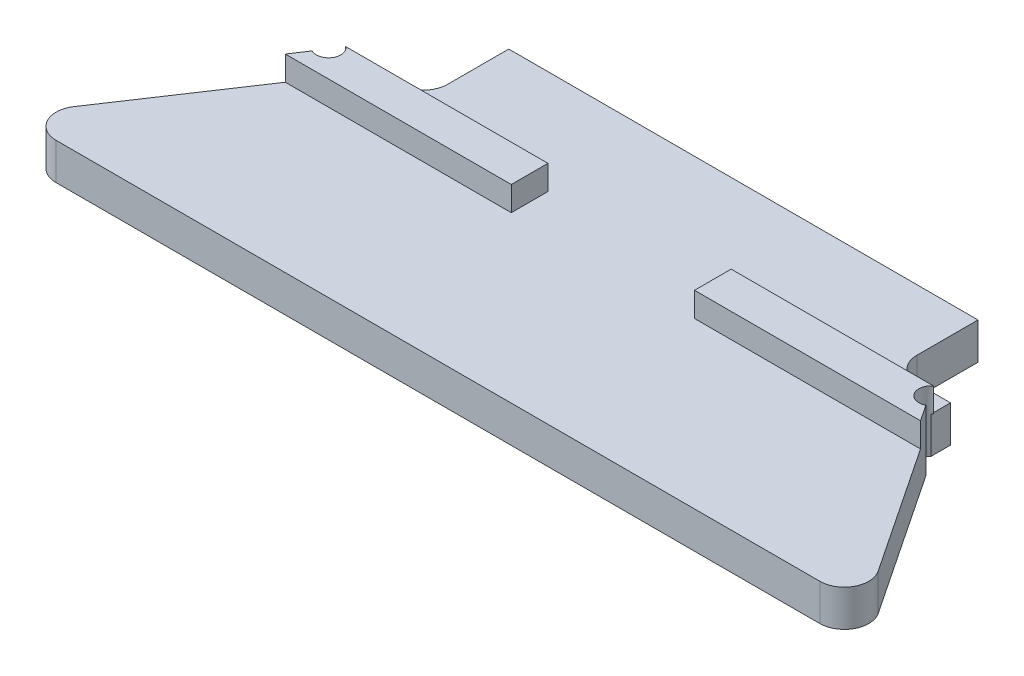
ISO-10303-21;
HEADER;
FILE_DESCRIPTION(('STEP AP214'),'2;1');
FILE_NAME('part.step','',(''),(''),'','','');
FILE_SCHEMA(('AUTOMOTIVE_DESIGN { 1 0 10303 214 1 1 1 1 }'));
ENDSEC;
DATA;
#1=APPLICATION_CONTEXT('core data for automotive mechanical design processes');
#2=APPLICATION_PROTOCOL_DEFINITION('international standard','automotive_design',2000,#1);
#3=PRODUCT_CONTEXT('',#1,'mechanical');
#4=PRODUCT('Part','Part','',(#3));
#5=PRODUCT_RELATED_PRODUCT_CATEGORY('part','',(#4));
#6=PRODUCT_DEFINITION_FORMATION('','',#4);
#7=PRODUCT_DEFINITION_CONTEXT('part definition',#1,'design');
#8=PRODUCT_DEFINITION('design','',#6,#7);
#9=PRODUCT_DEFINITION_SHAPE('','',#8);
#10=(LENGTH_UNIT() NAMED_UNIT(*) SI_UNIT(.MILLI.,.METRE.));
#11=(NAMED_UNIT(*) PLANE_ANGLE_UNIT() SI_UNIT($,.RADIAN.));
#12=(NAMED_UNIT(*) SI_UNIT($,.STERADIAN.) SOLID_ANGLE_UNIT());
#13=UNCERTAINTY_MEASURE_WITH_UNIT(LENGTH_MEASURE(1.E-05),#10,'distance_accuracy_value','');
#14=(GEOMETRIC_REPRESENTATION_CONTEXT(3) GLOBAL_UNCERTAINTY_ASSIGNED_CONTEXT((#13)) GLOBAL_UNIT_ASSIGNED_CONTEXT((#10,
#11,#12)) REPRESENTATION_CONTEXT('',''));
#15=CARTESIAN_POINT('',(0.,0.,0.));
#16=DIRECTION('',(0.,0.,1.));
#17=DIRECTION('',(1.,0.,0.));
#18=AXIS2_PLACEMENT_3D('',#15,#16,#17);
#19=CARTESIAN_POINT('',(0.,1.5,0.));
#20=DIRECTION('',(0.,1.,0.));
#21=DIRECTION('',(0.,0.,1.));
#22=AXIS2_PLACEMENT_3D('',#19,#20,#21);
#23=PLANE('',#22);
#24=DIRECTION('',(0.,0.,1.));
#25=VECTOR('',#24,1.);
#26=CARTESIAN_POINT('',(7.50000000000001,1.5,-4.00000000000001));
#27=LINE('',#26,#25);
#28=CARTESIAN_POINT('',(7.50000000000001,1.5,-4.00000000000001));
#29=VERTEX_POINT('',#28);
#30=CARTESIAN_POINT('',(7.50000000000001,1.5,-1.00000000000001));
#31=VERTEX_POINT('',#30);
#32=EDGE_CURVE('E545',#29,#31,#27,.T.);
#33=ORIENTED_EDGE('',*,*,#32,.F.);
#34=DIRECTION('',(-1.,0.,0.));
#35=VECTOR('',#34,1.);
#36=CARTESIAN_POINT('',(24.0539961789487,1.5,-4.00000000000001));
#37=LINE('',#36,#35);
#38=CARTESIAN_POINT('',(23.95625,1.5,-4.00000000000001));
#39=VERTEX_POINT('',#38);
#40=EDGE_CURVE('E523',#39,#29,#37,.T.);
#41=ORIENTED_EDGE('',*,*,#40,.F.);
#42=DIRECTION('',(0.,0.,1.));
#43=VECTOR('',#42,1.);
#44=CARTESIAN_POINT('',(23.95625,1.5,0.));
#45=LINE('',#44,#43);
#46=CARTESIAN_POINT('',(23.95625,1.5,-5.50000000000001));
#47=VERTEX_POINT('',#46);
#48=EDGE_CURVE('E286',#47,#39,#45,.T.);
#49=ORIENTED_EDGE('',*,*,#48,.F.);
#50=DIRECTION('',(-1.,0.,0.));
#51=VECTOR('',#50,1.);
#52=CARTESIAN_POINT('',(24.20625,1.5,-5.50000000000001));
#53=LINE('',#52,#51);
#54=CARTESIAN_POINT('',(21.20625,1.5,-5.50000000000001));
#55=VERTEX_POINT('',#54);
#56=EDGE_CURVE('E304',#47,#55,#53,.T.);
#57=ORIENTED_EDGE('',*,*,#56,.T.);
#58=CARTESIAN_POINT('',(21.20625,1.5,-7.50000000000001));
#59=DIRECTION('',(0.,1.,0.));
#60=DIRECTION('',(0.,0.,1.));
#61=AXIS2_PLACEMENT_3D('',#58,#59,#60);
#62=CIRCLE('',#61,2.);
#63=CARTESIAN_POINT('',(19.20625,1.5,-7.50000000000001));
#64=VERTEX_POINT('',#63);
#65=EDGE_CURVE('E379',#55,#64,#62,.F.);
#66=ORIENTED_EDGE('',*,*,#65,.T.);
#67=DIRECTION('',(0.,0.,-1.));
#68=VECTOR('',#67,1.);
#69=CARTESIAN_POINT('',(19.20625,1.5,-5.50000000000001));
#70=LINE('',#69,#68);
#71=CARTESIAN_POINT('',(19.20625,1.5,-12.5));
#72=VERTEX_POINT('',#71);
#73=EDGE_CURVE('E307',#64,#72,#70,.T.);
#74=ORIENTED_EDGE('',*,*,#73,.T.);
#75=DIRECTION('',(-1.,0.,0.));
#76=VECTOR('',#75,1.);
#77=CARTESIAN_POINT('',(-19.20625,1.5,-12.5));
#78=LINE('',#77,#76);
#79=CARTESIAN_POINT('',(-19.20625,1.5,-12.5));
#80=VERTEX_POINT('',#79);
#81=EDGE_CURVE('E309',#72,#80,#78,.T.);
#82=ORIENTED_EDGE('',*,*,#81,.T.);
#83=DIRECTION('',(0.,0.,1.));
#84=VECTOR('',#83,1.);
#85=CARTESIAN_POINT('',(-19.20625,1.5,-5.50000000000001));
#86=LINE('',#85,#84);
#87=CARTESIAN_POINT('',(-19.20625,1.5,-7.50000000000001));
#88=VERTEX_POINT('',#87);
#89=EDGE_CURVE('E311',#80,#88,#86,.T.);
#90=ORIENTED_EDGE('',*,*,#89,.T.);
#91=CARTESIAN_POINT('',(-21.20625,1.5,-7.50000000000001));
#92=DIRECTION('',(0.,1.,0.));
#93=DIRECTION('',(0.,0.,1.));
#94=AXIS2_PLACEMENT_3D('',#91,#92,#93);
#95=CIRCLE('',#94,2.);
#96=CARTESIAN_POINT('',(-21.20625,1.5,-5.50000000000001));
#97=VERTEX_POINT('',#96);
#98=EDGE_CURVE('E11',#88,#97,#95,.F.);
#99=ORIENTED_EDGE('',*,*,#98,.T.);
#100=DIRECTION('',(-1.,0.,0.));
#101=VECTOR('',#100,1.);
#102=CARTESIAN_POINT('',(-24.20625,1.5,-5.50000000000001));
#103=LINE('',#102,#101);
#104=CARTESIAN_POINT('',(-23.95625,1.5,-5.50000000000001));
#105=VERTEX_POINT('',#104);
#106=EDGE_CURVE('E314',#97,#105,#103,.T.);
#107=ORIENTED_EDGE('',*,*,#106,.T.);
#108=DIRECTION('',(0.,0.,-1.));
#109=VECTOR('',#108,1.);
#110=CARTESIAN_POINT('',(-23.95625,1.5,0.));
#111=LINE('',#110,#109);
#112=CARTESIAN_POINT('',(-23.95625,1.5,-4.00000000000001));
#113=VERTEX_POINT('',#112);
#114=EDGE_CURVE('E292',#113,#105,#111,.T.);
#115=ORIENTED_EDGE('',*,*,#114,.F.);
#116=DIRECTION('',(-1.,0.,0.));
#117=VECTOR('',#116,1.);
#118=CARTESIAN_POINT('',(-24.0539961789487,1.5,-4.00000000000001));
#119=LINE('',#118,#117);
#120=CARTESIAN_POINT('',(-7.49999999999999,1.5,-4.00000000000001));
#121=VERTEX_POINT('',#120);
#122=EDGE_CURVE('E53',#121,#113,#119,.T.);
#123=ORIENTED_EDGE('',*,*,#122,.F.);
#124=DIRECTION('',(0.,0.,-1.));
#125=VECTOR('',#124,1.);
#126=CARTESIAN_POINT('',(-7.49999999999999,1.5,-4.00000000000001));
#127=LINE('',#126,#125);
#128=CARTESIAN_POINT('',(-7.49999999999999,1.5,-1.00000000000001));
#129=VERTEX_POINT('',#128);
#130=EDGE_CURVE('E252',#129,#121,#127,.T.);
#131=ORIENTED_EDGE('',*,*,#130,.F.);
#132=DIRECTION('',(1.,0.,0.));
#133=VECTOR('',#132,1.);
#134=CARTESIAN_POINT('',(-7.49999999999999,1.5,-1.00000000000001));
#135=LINE('',#134,#133);
#136=CARTESIAN_POINT('',(-26.,1.5,-1.00000000000001));
#137=VERTEX_POINT('',#136);
#138=EDGE_CURVE('E59',#137,#129,#135,.T.);
#139=ORIENTED_EDGE('',*,*,#138,.F.);
#140=DIRECTION('',(-0.554700196225229,0.,0.832050294337844));
#141=VECTOR('',#140,1.);
#142=CARTESIAN_POINT('',(-25.,1.5,-2.49999999999999));
#143=LINE('',#142,#141);
#144=CARTESIAN_POINT('',(-32.927066405033,1.5,9.39059960754954));
#145=VERTEX_POINT('',#144);
#146=EDGE_CURVE('E317',#137,#145,#143,.T.);
#147=ORIENTED_EDGE('',*,*,#146,.T.);
#148=CARTESIAN_POINT('',(-31.2629658163573,1.5,10.5));
#149=DIRECTION('',(0.,1.,0.));
#150=DIRECTION('',(0.,0.,1.));
#151=AXIS2_PLACEMENT_3D('',#148,#149,#150);
#152=CIRCLE('',#151,2.);
#153=CARTESIAN_POINT('',(-31.2629658163573,1.5,12.5));
#154=VERTEX_POINT('',#153);
#155=EDGE_CURVE('E365',#145,#154,#152,.T.);
#156=ORIENTED_EDGE('',*,*,#155,.T.);
#157=DIRECTION('',(1.,0.,0.));
#158=VECTOR('',#157,1.);
#159=CARTESIAN_POINT('',(-35.,1.5,12.5));
#160=LINE('',#159,#158);
#161=CARTESIAN_POINT('',(31.2629658163574,1.5,12.5));
#162=VERTEX_POINT('',#161);
#163=EDGE_CURVE('E297',#154,#162,#160,.T.);
#164=ORIENTED_EDGE('',*,*,#163,.T.);
#165=CARTESIAN_POINT('',(31.2629658163574,1.5,10.5));
#166=DIRECTION('',(0.,1.,0.));
#167=DIRECTION('',(0.,0.,1.));
#168=AXIS2_PLACEMENT_3D('',#165,#166,#167);
#169=CIRCLE('',#168,2.);
#170=CARTESIAN_POINT('',(32.927066405033,1.5,9.39059960754954));
#171=VERTEX_POINT('',#170);
#172=EDGE_CURVE('E367',#162,#171,#169,.T.);
#173=ORIENTED_EDGE('',*,*,#172,.T.);
#174=DIRECTION('',(-0.554700196225229,0.,-0.832050294337843));
#175=VECTOR('',#174,1.);
#176=CARTESIAN_POINT('',(25.,1.5,-2.5));
#177=LINE('',#176,#175);
#178=CARTESIAN_POINT('',(26.,1.5,-1.00000000000001));
#179=VERTEX_POINT('',#178);
#180=EDGE_CURVE('E300',#171,#179,#177,.T.);
#181=ORIENTED_EDGE('',*,*,#180,.T.);
#182=DIRECTION('',(1.,0.,0.));
#183=VECTOR('',#182,1.);
#184=CARTESIAN_POINT('',(7.50000000000001,1.5,-1.00000000000001));
#185=LINE('',#184,#183);
#186=EDGE_CURVE('E223',#31,#179,#185,.T.);
#187=ORIENTED_EDGE('',*,*,#186,.F.);
#188=EDGE_LOOP('',(#33,#41,#49,#57,#66,#74,#82,#90,#99,#107,#115,#123,#131,#139,#147,#156,#164,
#173,#181,#187));
#189=FACE_BOUND('',#188,.T.);
#190=ADVANCED_FACE('F38',(#189),#23,.T.);
#191=CARTESIAN_POINT('',(35.,1.5,12.5));
#192=DIRECTION('',(0.,0.,-1.));
#193=DIRECTION('',(-1.,0.,0.));
#194=AXIS2_PLACEMENT_3D('',#191,#192,#193);
#195=PLANE('',#194);
#196=DIRECTION('',(1.,0.,0.));
#197=VECTOR('',#196,1.);
#198=CARTESIAN_POINT('',(35.,-1.5,12.5));
#199=LINE('',#198,#197);
#200=CARTESIAN_POINT('',(-31.2629658163573,-1.5,12.5));
#201=VERTEX_POINT('',#200);
#202=CARTESIAN_POINT('',(31.2629658163574,-1.5,12.5));
#203=VERTEX_POINT('',#202);
#204=EDGE_CURVE('E296',#201,#203,#199,.T.);
#205=ORIENTED_EDGE('',*,*,#204,.T.);
#206=DIRECTION('',(0.,-1.,0.));
#207=VECTOR('',#206,1.);
#208=CARTESIAN_POINT('',(31.2629658163574,1.5,12.5));
#209=LINE('',#208,#207);
#210=EDGE_CURVE('E363',#203,#162,#209,.F.);
#211=ORIENTED_EDGE('',*,*,#210,.T.);
#212=ORIENTED_EDGE('',*,*,#163,.F.);
#213=DIRECTION('',(0.,-1.,0.));
#214=VECTOR('',#213,1.);
#215=CARTESIAN_POINT('',(-31.2629658163573,1.5,12.5));
#216=LINE('',#215,#214);
#217=EDGE_CURVE('E360',#154,#201,#216,.T.);
#218=ORIENTED_EDGE('',*,*,#217,.T.);
#219=EDGE_LOOP('',(#205,#211,#212,#218));
#220=FACE_BOUND('',#219,.T.);
#221=ADVANCED_FACE('F431',(#220),#195,.F.);
#222=CARTESIAN_POINT('',(25.,1.5,-2.5));
#223=DIRECTION('',(-0.832050294337844,0.,0.554700196225229));
#224=DIRECTION('',(0.554700196225229,0.,0.832050294337844));
#225=AXIS2_PLACEMENT_3D('',#222,#223,#224);
#226=PLANE('',#225);
#227=ORIENTED_EDGE('',*,*,#180,.F.);
#228=DIRECTION('',(0.,-1.,0.));
#229=VECTOR('',#228,1.);
#230=CARTESIAN_POINT('',(32.927066405033,1.5,9.39059960754954));
#231=LINE('',#230,#229);
#232=CARTESIAN_POINT('',(32.927066405033,-1.5,9.39059960754954));
#233=VERTEX_POINT('',#232);
#234=EDGE_CURVE('E353',#171,#233,#231,.T.);
#235=ORIENTED_EDGE('',*,*,#234,.T.);
#236=DIRECTION('',(-0.554700196225229,0.,-0.832050294337843));
#237=VECTOR('',#236,1.);
#238=CARTESIAN_POINT('',(25.,-1.5,-2.5));
#239=LINE('',#238,#237);
#240=CARTESIAN_POINT('',(25.1212626139406,-1.5,-2.31810607908908));
#241=VERTEX_POINT('',#240);
#242=EDGE_CURVE('E322',#233,#241,#239,.T.);
#243=ORIENTED_EDGE('',*,*,#242,.T.);
#244=DIRECTION('',(0.,1.,0.));
#245=VECTOR('',#244,1.);
#246=CARTESIAN_POINT('',(25.1212626139406,-1.5,-2.31810607908908));
#247=LINE('',#246,#245);
#248=CARTESIAN_POINT('',(25.1212626139406,3.5,-2.31810607908908));
#249=VERTEX_POINT('',#248);
#250=EDGE_CURVE('E276',#241,#249,#247,.T.);
#251=ORIENTED_EDGE('',*,*,#250,.T.);
#252=DIRECTION('',(-0.554700196225229,0.,-0.832050294337844));
#253=VECTOR('',#252,1.);
#254=CARTESIAN_POINT('',(26.,3.5,-1.00000000000001));
#255=LINE('',#254,#253);
#256=CARTESIAN_POINT('',(26.,3.5,-1.00000000000001));
#257=VERTEX_POINT('',#256);
#258=EDGE_CURVE('E220',#257,#249,#255,.T.);
#259=ORIENTED_EDGE('',*,*,#258,.F.);
#260=DIRECTION('',(0.,-1.,0.));
#261=VECTOR('',#260,1.);
#262=CARTESIAN_POINT('',(26.,3.5,-1.00000000000001));
#263=LINE('',#262,#261);
#264=EDGE_CURVE('E536',#257,#179,#263,.T.);
#265=ORIENTED_EDGE('',*,*,#264,.T.);
#266=EDGE_LOOP('',(#227,#235,#243,#251,#259,#265));
#267=FACE_BOUND('',#266,.T.);
#268=ADVANCED_FACE('F457',(#267),#226,.F.);
#269=CARTESIAN_POINT('',(24.20625,1.5,-5.50000000000001));
#270=DIRECTION('',(0.,0.,1.));
#271=DIRECTION('',(1.,0.,0.));
#272=AXIS2_PLACEMENT_3D('',#269,#270,#271);
#273=PLANE('',#272);
#274=DIRECTION('',(-1.,0.,0.));
#275=VECTOR('',#274,1.);
#276=CARTESIAN_POINT('',(24.20625,-1.5,-5.50000000000001));
#277=LINE('',#276,#275);
#278=CARTESIAN_POINT('',(23.95625,-1.5,-5.50000000000001));
#279=VERTEX_POINT('',#278);
#280=CARTESIAN_POINT('',(21.20625,-1.5,-5.50000000000001));
#281=VERTEX_POINT('',#280);
#282=EDGE_CURVE('E324',#279,#281,#277,.T.);
#283=ORIENTED_EDGE('',*,*,#282,.T.);
#284=DIRECTION('',(0.,-1.,0.));
#285=VECTOR('',#284,1.);
#286=CARTESIAN_POINT('',(21.20625,1.5,-5.50000000000001));
#287=LINE('',#286,#285);
#288=EDGE_CURVE('E351',#281,#55,#287,.F.);
#289=ORIENTED_EDGE('',*,*,#288,.T.);
#290=ORIENTED_EDGE('',*,*,#56,.F.);
#291=DIRECTION('',(0.,1.,0.));
#292=VECTOR('',#291,1.);
#293=CARTESIAN_POINT('',(23.95625,-1.5,-5.50000000000001));
#294=LINE('',#293,#292);
#295=EDGE_CURVE('E283',#279,#47,#294,.T.);
#296=ORIENTED_EDGE('',*,*,#295,.F.);
#297=EDGE_LOOP('',(#283,#289,#290,#296));
#298=FACE_BOUND('',#297,.T.);
#299=ADVANCED_FACE('F478',(#298),#273,.F.);
#300=CARTESIAN_POINT('',(19.20625,1.5,-5.50000000000001));
#301=DIRECTION('',(-1.,0.,0.));
#302=DIRECTION('',(0.,0.,1.));
#303=AXIS2_PLACEMENT_3D('',#300,#301,#302);
#304=PLANE('',#303);
#305=ORIENTED_EDGE('',*,*,#73,.F.);
#306=DIRECTION('',(0.,-1.,0.));
#307=VECTOR('',#306,1.);
#308=CARTESIAN_POINT('',(19.20625,-1.5,-7.50000000000001));
#309=LINE('',#308,#307);
#310=CARTESIAN_POINT('',(19.20625,-1.5,-7.50000000000001));
#311=VERTEX_POINT('',#310);
#312=EDGE_CURVE('E348',#64,#311,#309,.T.);
#313=ORIENTED_EDGE('',*,*,#312,.T.);
#314=DIRECTION('',(0.,0.,-1.));
#315=VECTOR('',#314,1.);
#316=CARTESIAN_POINT('',(19.20625,-1.5,-5.50000000000001));
#317=LINE('',#316,#315);
#318=CARTESIAN_POINT('',(19.20625,-1.5,-12.5));
#319=VERTEX_POINT('',#318);
#320=EDGE_CURVE('E327',#311,#319,#317,.T.);
#321=ORIENTED_EDGE('',*,*,#320,.T.);
#322=DIRECTION('',(0.,-1.,0.));
#323=VECTOR('',#322,1.);
#324=CARTESIAN_POINT('',(19.20625,1.5,-12.5));
#325=LINE('',#324,#323);
#326=EDGE_CURVE('E340',#72,#319,#325,.T.);
#327=ORIENTED_EDGE('',*,*,#326,.F.);
#328=EDGE_LOOP('',(#305,#313,#321,#327));
#329=FACE_BOUND('',#328,.T.);
#330=ADVANCED_FACE('F474',(#329),#304,.F.);
#331=CARTESIAN_POINT('',(-19.20625,1.5,-12.5));
#332=DIRECTION('',(0.,0.,1.));
#333=DIRECTION('',(1.,0.,0.));
#334=AXIS2_PLACEMENT_3D('',#331,#332,#333);
#335=PLANE('',#334);
#336=DIRECTION('',(-1.,0.,0.));
#337=VECTOR('',#336,1.);
#338=CARTESIAN_POINT('',(-19.20625,-1.5,-12.5));
#339=LINE('',#338,#337);
#340=CARTESIAN_POINT('',(-19.20625,-1.5,-12.5));
#341=VERTEX_POINT('',#340);
#342=EDGE_CURVE('E329',#319,#341,#339,.T.);
#343=ORIENTED_EDGE('',*,*,#342,.T.);
#344=DIRECTION('',(0.,-1.,0.));
#345=VECTOR('',#344,1.);
#346=CARTESIAN_POINT('',(-19.20625,1.5,-12.5));
#347=LINE('',#346,#345);
#348=EDGE_CURVE('E319',#80,#341,#347,.T.);
#349=ORIENTED_EDGE('',*,*,#348,.F.);
#350=ORIENTED_EDGE('',*,*,#81,.F.);
#351=ORIENTED_EDGE('',*,*,#326,.T.);
#352=EDGE_LOOP('',(#343,#349,#350,#351));
#353=FACE_BOUND('',#352,.T.);
#354=ADVANCED_FACE('F471',(#353),#335,.F.);
#355=CARTESIAN_POINT('',(-19.20625,1.5,-5.50000000000001));
#356=DIRECTION('',(1.,0.,0.));
#357=DIRECTION('',(0.,0.,-1.));
#358=AXIS2_PLACEMENT_3D('',#355,#356,#357);
#359=PLANE('',#358);
#360=DIRECTION('',(0.,0.,1.));
#361=VECTOR('',#360,1.);
#362=CARTESIAN_POINT('',(-19.20625,-1.5,-5.50000000000001));
#363=LINE('',#362,#361);
#364=CARTESIAN_POINT('',(-19.20625,-1.5,-7.50000000000001));
#365=VERTEX_POINT('',#364);
#366=EDGE_CURVE('E331',#341,#365,#363,.T.);
#367=ORIENTED_EDGE('',*,*,#366,.T.);
#368=DIRECTION('',(0.,-1.,0.));
#369=VECTOR('',#368,1.);
#370=CARTESIAN_POINT('',(-19.20625,1.5,-7.50000000000001));
#371=LINE('',#370,#369);
#372=EDGE_CURVE('E372',#365,#88,#371,.F.);
#373=ORIENTED_EDGE('',*,*,#372,.T.);
#374=ORIENTED_EDGE('',*,*,#89,.F.);
#375=ORIENTED_EDGE('',*,*,#348,.T.);
#376=EDGE_LOOP('',(#367,#373,#374,#375));
#377=FACE_BOUND('',#376,.T.);
#378=ADVANCED_FACE('F390',(#377),#359,.F.);
#379=CARTESIAN_POINT('',(-24.20625,1.5,-5.50000000000001));
#380=DIRECTION('',(0.,0.,1.));
#381=DIRECTION('',(1.,0.,0.));
#382=AXIS2_PLACEMENT_3D('',#379,#380,#381);
#383=PLANE('',#382);
#384=ORIENTED_EDGE('',*,*,#106,.F.);
#385=DIRECTION('',(0.,-1.,0.));
#386=VECTOR('',#385,1.);
#387=CARTESIAN_POINT('',(-21.20625,-1.5,-5.50000000000001));
#388=LINE('',#387,#386);
#389=CARTESIAN_POINT('',(-21.20625,-1.5,-5.50000000000001));
#390=VERTEX_POINT('',#389);
#391=EDGE_CURVE('E369',#97,#390,#388,.T.);
#392=ORIENTED_EDGE('',*,*,#391,.T.);
#393=DIRECTION('',(-1.,0.,0.));
#394=VECTOR('',#393,1.);
#395=CARTESIAN_POINT('',(-24.20625,-1.5,-5.50000000000001));
#396=LINE('',#395,#394);
#397=CARTESIAN_POINT('',(-23.95625,-1.5,-5.50000000000001));
#398=VERTEX_POINT('',#397);
#399=EDGE_CURVE('E334',#390,#398,#396,.T.);
#400=ORIENTED_EDGE('',*,*,#399,.T.);
#401=DIRECTION('',(0.,1.,0.));
#402=VECTOR('',#401,1.);
#403=CARTESIAN_POINT('',(-23.95625,-1.5,-5.50000000000001));
#404=LINE('',#403,#402);
#405=EDGE_CURVE('E282',#398,#105,#404,.T.);
#406=ORIENTED_EDGE('',*,*,#405,.T.);
#407=EDGE_LOOP('',(#384,#392,#400,#406));
#408=FACE_BOUND('',#407,.T.);
#409=ADVANCED_FACE('F398',(#408),#383,.F.);
#410=CARTESIAN_POINT('',(-25.,1.5,-2.49999999999999));
#411=DIRECTION('',(0.832050294337844,0.,0.554700196225229));
#412=DIRECTION('',(0.554700196225229,0.,-0.832050294337844));
#413=AXIS2_PLACEMENT_3D('',#410,#411,#412);
#414=PLANE('',#413);
#415=DIRECTION('',(-0.554700196225229,0.,0.832050294337844));
#416=VECTOR('',#415,1.);
#417=CARTESIAN_POINT('',(-25.,-1.5,-2.49999999999999));
#418=LINE('',#417,#416);
#419=CARTESIAN_POINT('',(-25.1212626139406,-1.5,-2.31810607908908));
#420=VERTEX_POINT('',#419);
#421=CARTESIAN_POINT('',(-32.927066405033,-1.5,9.39059960754954));
#422=VERTEX_POINT('',#421);
#423=EDGE_CURVE('E301',#420,#422,#418,.T.);
#424=ORIENTED_EDGE('',*,*,#423,.T.);
#425=DIRECTION('',(0.,-1.,0.));
#426=VECTOR('',#425,1.);
#427=CARTESIAN_POINT('',(-32.927066405033,1.5,9.39059960754954));
#428=LINE('',#427,#426);
#429=EDGE_CURVE('E374',#422,#145,#428,.F.);
#430=ORIENTED_EDGE('',*,*,#429,.T.);
#431=ORIENTED_EDGE('',*,*,#146,.F.);
#432=DIRECTION('',(0.,-1.,0.));
#433=VECTOR('',#432,1.);
#434=CARTESIAN_POINT('',(-26.,3.5,-1.00000000000001));
#435=LINE('',#434,#433);
#436=CARTESIAN_POINT('',(-26.,3.5,-1.00000000000001));
#437=VERTEX_POINT('',#436);
#438=EDGE_CURVE('E264',#437,#137,#435,.T.);
#439=ORIENTED_EDGE('',*,*,#438,.F.);
#440=DIRECTION('',(-0.554700196225229,0.,0.832050294337843));
#441=VECTOR('',#440,1.);
#442=CARTESIAN_POINT('',(-25.1212626139406,3.5,-2.31810607908908));
#443=LINE('',#442,#441);
#444=CARTESIAN_POINT('',(-25.1212626139406,3.5,-2.31810607908908));
#445=VERTEX_POINT('',#444);
#446=EDGE_CURVE('E240',#445,#437,#443,.T.);
#447=ORIENTED_EDGE('',*,*,#446,.F.);
#448=DIRECTION('',(0.,1.,0.));
#449=VECTOR('',#448,1.);
#450=CARTESIAN_POINT('',(-25.1212626139406,-1.5,-2.31810607908908));
#451=LINE('',#450,#449);
#452=EDGE_CURVE('E271',#445,#420,#451,.F.);
#453=ORIENTED_EDGE('',*,*,#452,.T.);
#454=EDGE_LOOP('',(#424,#430,#431,#439,#447,#453));
#455=FACE_BOUND('',#454,.T.);
#456=ADVANCED_FACE('F423',(#455),#414,.F.);
#457=CARTESIAN_POINT('',(0.,-1.5,0.));
#458=DIRECTION('',(0.,1.,0.));
#459=DIRECTION('',(0.,0.,1.));
#460=AXIS2_PLACEMENT_3D('',#457,#458,#459);
#461=PLANE('',#460);
#462=ORIENTED_EDGE('',*,*,#242,.F.);
#463=CARTESIAN_POINT('',(31.2629658163574,-1.5,10.5));
#464=DIRECTION('',(0.,1.,0.));
#465=DIRECTION('',(0.,0.,1.));
#466=AXIS2_PLACEMENT_3D('',#463,#464,#465);
#467=CIRCLE('',#466,2.);
#468=EDGE_CURVE('E358',#233,#203,#467,.F.);
#469=ORIENTED_EDGE('',*,*,#468,.T.);
#470=ORIENTED_EDGE('',*,*,#204,.F.);
#471=CARTESIAN_POINT('',(-31.2629658163573,-1.5,10.5));
#472=DIRECTION('',(0.,1.,0.));
#473=DIRECTION('',(0.,0.,1.));
#474=AXIS2_PLACEMENT_3D('',#471,#472,#473);
#475=CIRCLE('',#474,2.);
#476=EDGE_CURVE('E356',#201,#422,#475,.F.);
#477=ORIENTED_EDGE('',*,*,#476,.T.);
#478=ORIENTED_EDGE('',*,*,#423,.F.);
#479=CARTESIAN_POINT('',(-24.6633567811865,-1.5,-3.20710678118655));
#480=DIRECTION('',(0.,1.,0.));
#481=DIRECTION('',(0.,0.,1.));
#482=AXIS2_PLACEMENT_3D('',#479,#480,#481);
#483=CIRCLE('',#482,1.);
#484=CARTESIAN_POINT('',(-23.95625,-1.5,-3.91421356237311));
#485=VERTEX_POINT('',#484);
#486=EDGE_CURVE('E268',#420,#485,#483,.T.);
#487=ORIENTED_EDGE('',*,*,#486,.T.);
#488=DIRECTION('',(0.,0.,-1.));
#489=VECTOR('',#488,1.);
#490=CARTESIAN_POINT('',(-23.95625,-1.5,-5.50000000000001));
#491=LINE('',#490,#489);
#492=EDGE_CURVE('E279',#485,#398,#491,.T.);
#493=ORIENTED_EDGE('',*,*,#492,.T.);
#494=ORIENTED_EDGE('',*,*,#399,.F.);
#495=CARTESIAN_POINT('',(-21.20625,-1.5,-7.50000000000001));
#496=DIRECTION('',(0.,1.,0.));
#497=DIRECTION('',(0.,0.,1.));
#498=AXIS2_PLACEMENT_3D('',#495,#496,#497);
#499=CIRCLE('',#498,2.);
#500=EDGE_CURVE('E46',#390,#365,#499,.T.);
#501=ORIENTED_EDGE('',*,*,#500,.T.);
#502=ORIENTED_EDGE('',*,*,#366,.F.);
#503=ORIENTED_EDGE('',*,*,#342,.F.);
#504=ORIENTED_EDGE('',*,*,#320,.F.);
#505=CARTESIAN_POINT('',(21.20625,-1.5,-7.50000000000001));
#506=DIRECTION('',(0.,1.,0.));
#507=DIRECTION('',(0.,0.,1.));
#508=AXIS2_PLACEMENT_3D('',#505,#506,#507);
#509=CIRCLE('',#508,2.);
#510=EDGE_CURVE('E377',#311,#281,#509,.T.);
#511=ORIENTED_EDGE('',*,*,#510,.T.);
#512=ORIENTED_EDGE('',*,*,#282,.F.);
#513=DIRECTION('',(0.,0.,1.));
#514=VECTOR('',#513,1.);
#515=CARTESIAN_POINT('',(23.95625,-1.5,-5.50000000000001));
#516=LINE('',#515,#514);
#517=CARTESIAN_POINT('',(23.95625,-1.5,-3.91421356237311));
#518=VERTEX_POINT('',#517);
#519=EDGE_CURVE('E278',#279,#518,#516,.T.);
#520=ORIENTED_EDGE('',*,*,#519,.T.);
#521=CARTESIAN_POINT('',(24.6633567811865,-1.5,-3.20710678118655));
#522=DIRECTION('',(0.,1.,0.));
#523=DIRECTION('',(0.,0.,-1.));
#524=AXIS2_PLACEMENT_3D('',#521,#522,#523);
#525=CIRCLE('',#524,1.);
#526=EDGE_CURVE('E267',#518,#241,#525,.T.);
#527=ORIENTED_EDGE('',*,*,#526,.T.);
#528=EDGE_LOOP('',(#462,#469,#470,#477,#478,#487,#493,#494,#501,#502,#503,#504,#511,#512,#520,#527));
#529=FACE_BOUND('',#528,.T.);
#530=ADVANCED_FACE('F384',(#529),#461,.F.);
#531=CARTESIAN_POINT('',(23.95625,-1.5,-5.50000000000001));
#532=DIRECTION('',(-1.,0.,0.));
#533=DIRECTION('',(0.,0.,1.));
#534=AXIS2_PLACEMENT_3D('',#531,#532,#533);
#535=PLANE('',#534);
#536=ORIENTED_EDGE('',*,*,#48,.T.);
#537=DIRECTION('',(0.,0.,-1.));
#538=VECTOR('',#537,1.);
#539=CARTESIAN_POINT('',(23.95625,1.5,-5.50000000000001));
#540=LINE('',#539,#538);
#541=CARTESIAN_POINT('',(23.95625,1.5,-3.91421356237311));
#542=VERTEX_POINT('',#541);
#543=EDGE_CURVE('E229',#542,#39,#540,.T.);
#544=ORIENTED_EDGE('',*,*,#543,.F.);
#545=DIRECTION('',(0.,1.,0.));
#546=VECTOR('',#545,1.);
#547=CARTESIAN_POINT('',(23.95625,-1.5,-3.91421356237311));
#548=LINE('',#547,#546);
#549=EDGE_CURVE('E345',#542,#518,#548,.F.);
#550=ORIENTED_EDGE('',*,*,#549,.T.);
#551=ORIENTED_EDGE('',*,*,#519,.F.);
#552=ORIENTED_EDGE('',*,*,#295,.T.);
#553=EDGE_LOOP('',(#536,#544,#550,#551,#552));
#554=FACE_BOUND('',#553,.T.);
#555=ADVANCED_FACE('F461',(#554),#535,.F.);
#556=CARTESIAN_POINT('',(-23.95625,-1.5,-5.50000000000001));
#557=DIRECTION('',(1.,0.,0.));
#558=DIRECTION('',(0.,0.,-1.));
#559=AXIS2_PLACEMENT_3D('',#556,#557,#558);
#560=PLANE('',#559);
#561=ORIENTED_EDGE('',*,*,#492,.F.);
#562=DIRECTION('',(0.,1.,0.));
#563=VECTOR('',#562,1.);
#564=CARTESIAN_POINT('',(-23.95625,-1.5,-3.91421356237311));
#565=LINE('',#564,#563);
#566=CARTESIAN_POINT('',(-23.95625,1.5,-3.91421356237311));
#567=VERTEX_POINT('',#566);
#568=EDGE_CURVE('E343',#485,#567,#565,.T.);
#569=ORIENTED_EDGE('',*,*,#568,.T.);
#570=EDGE_CURVE('E293',#567,#113,#111,.T.);
#571=ORIENTED_EDGE('',*,*,#570,.T.);
#572=ORIENTED_EDGE('',*,*,#114,.T.);
#573=ORIENTED_EDGE('',*,*,#405,.F.);
#574=EDGE_LOOP('',(#561,#569,#571,#572,#573));
#575=FACE_BOUND('',#574,.T.);
#576=ADVANCED_FACE('F402',(#575),#560,.F.);
#577=CARTESIAN_POINT('',(-24.6633567811865,-1.5,-3.20710678118655));
#578=DIRECTION('',(0.,1.,0.));
#579=DIRECTION('',(0.,0.,1.));
#580=AXIS2_PLACEMENT_3D('',#577,#578,#579);
#581=CYLINDRICAL_SURFACE('',#580,1.);
#582=ORIENTED_EDGE('',*,*,#486,.F.);
#583=ORIENTED_EDGE('',*,*,#452,.F.);
#584=CARTESIAN_POINT('',(-24.6633567811865,3.5,-3.20710678118655));
#585=DIRECTION('',(0.,-1.,0.));
#586=DIRECTION('',(0.,0.,-1.));
#587=AXIS2_PLACEMENT_3D('',#584,#585,#586);
#588=CIRCLE('',#587,1.);
#589=CARTESIAN_POINT('',(-24.0539961789487,3.5,-4.00000000000001));
#590=VERTEX_POINT('',#589);
#591=EDGE_CURVE('E237',#590,#445,#588,.T.);
#592=ORIENTED_EDGE('',*,*,#591,.F.);
#593=DIRECTION('',(0.,-1.,0.));
#594=VECTOR('',#593,1.);
#595=CARTESIAN_POINT('',(-24.0539961789487,3.5,-4.00000000000001));
#596=LINE('',#595,#594);
#597=CARTESIAN_POINT('',(-24.0539961789487,1.5,-4.00000000000001));
#598=VERTEX_POINT('',#597);
#599=EDGE_CURVE('E248',#590,#598,#596,.T.);
#600=ORIENTED_EDGE('',*,*,#599,.T.);
#601=CARTESIAN_POINT('',(-24.6633567811865,1.5,-3.20710678118655));
#602=DIRECTION('',(0.,-1.,0.));
#603=DIRECTION('',(0.,0.,-1.));
#604=AXIS2_PLACEMENT_3D('',#601,#602,#603);
#605=CIRCLE('',#604,1.);
#606=EDGE_CURVE('E231',#598,#567,#605,.T.);
#607=ORIENTED_EDGE('',*,*,#606,.T.);
#608=ORIENTED_EDGE('',*,*,#568,.F.);
#609=EDGE_LOOP('',(#582,#583,#592,#600,#607,#608));
#610=FACE_BOUND('',#609,.T.);
#611=ADVANCED_FACE('F437',(#610),#581,.F.);
#612=CARTESIAN_POINT('',(24.6633567811865,-1.5,-3.20710678118655));
#613=DIRECTION('',(0.,1.,0.));
#614=DIRECTION('',(0.,0.,1.));
#615=AXIS2_PLACEMENT_3D('',#612,#613,#614);
#616=CYLINDRICAL_SURFACE('',#615,1.);
#617=ORIENTED_EDGE('',*,*,#526,.F.);
#618=ORIENTED_EDGE('',*,*,#549,.F.);
#619=CARTESIAN_POINT('',(24.6633567811865,1.5,-3.20710678118655));
#620=DIRECTION('',(0.,-1.,0.));
#621=DIRECTION('',(0.,0.,1.));
#622=AXIS2_PLACEMENT_3D('',#619,#620,#621);
#623=CIRCLE('',#622,1.);
#624=CARTESIAN_POINT('',(24.0539961789487,1.5,-4.00000000000001));
#625=VERTEX_POINT('',#624);
#626=EDGE_CURVE('E227',#542,#625,#623,.T.);
#627=ORIENTED_EDGE('',*,*,#626,.T.);
#628=DIRECTION('',(0.,-1.,0.));
#629=VECTOR('',#628,1.);
#630=CARTESIAN_POINT('',(24.0539961789487,3.5,-4.00000000000001));
#631=LINE('',#630,#629);
#632=CARTESIAN_POINT('',(24.0539961789487,3.5,-4.00000000000001));
#633=VERTEX_POINT('',#632);
#634=EDGE_CURVE('E208',#633,#625,#631,.T.);
#635=ORIENTED_EDGE('',*,*,#634,.F.);
#636=CARTESIAN_POINT('',(24.6633567811865,3.5,-3.20710678118655));
#637=DIRECTION('',(0.,-1.,0.));
#638=DIRECTION('',(0.,0.,1.));
#639=AXIS2_PLACEMENT_3D('',#636,#637,#638);
#640=CIRCLE('',#639,1.);
#641=EDGE_CURVE('E214',#249,#633,#640,.T.);
#642=ORIENTED_EDGE('',*,*,#641,.F.);
#643=ORIENTED_EDGE('',*,*,#250,.F.);
#644=EDGE_LOOP('',(#617,#618,#627,#635,#642,#643));
#645=FACE_BOUND('',#644,.T.);
#646=ADVANCED_FACE('F225',(#645),#616,.F.);
#647=CARTESIAN_POINT('',(21.20625,1.5,-7.50000000000001));
#648=DIRECTION('',(0.,1.,0.));
#649=DIRECTION('',(0.,0.,1.));
#650=AXIS2_PLACEMENT_3D('',#647,#648,#649);
#651=CYLINDRICAL_SURFACE('',#650,2.);
#652=ORIENTED_EDGE('',*,*,#65,.F.);
#653=ORIENTED_EDGE('',*,*,#288,.F.);
#654=ORIENTED_EDGE('',*,*,#510,.F.);
#655=ORIENTED_EDGE('',*,*,#312,.F.);
#656=EDGE_LOOP('',(#652,#653,#654,#655));
#657=FACE_BOUND('',#656,.T.);
#658=ADVANCED_FACE('F486',(#657),#651,.F.);
#659=CARTESIAN_POINT('',(31.2629658163574,1.5,10.5));
#660=DIRECTION('',(0.,-1.,0.));
#661=DIRECTION('',(0.,0.,-1.));
#662=AXIS2_PLACEMENT_3D('',#659,#660,#661);
#663=CYLINDRICAL_SURFACE('',#662,2.);
#664=ORIENTED_EDGE('',*,*,#172,.F.);
#665=ORIENTED_EDGE('',*,*,#210,.F.);
#666=ORIENTED_EDGE('',*,*,#468,.F.);
#667=ORIENTED_EDGE('',*,*,#234,.F.);
#668=EDGE_LOOP('',(#664,#665,#666,#667));
#669=FACE_BOUND('',#668,.T.);
#670=ADVANCED_FACE('F489',(#669),#663,.T.);
#671=CARTESIAN_POINT('',(-21.20625,1.5,-7.50000000000001));
#672=DIRECTION('',(0.,1.,0.));
#673=DIRECTION('',(0.,0.,1.));
#674=AXIS2_PLACEMENT_3D('',#671,#672,#673);
#675=CYLINDRICAL_SURFACE('',#674,2.);
#676=ORIENTED_EDGE('',*,*,#98,.F.);
#677=ORIENTED_EDGE('',*,*,#372,.F.);
#678=ORIENTED_EDGE('',*,*,#500,.F.);
#679=ORIENTED_EDGE('',*,*,#391,.F.);
#680=EDGE_LOOP('',(#676,#677,#678,#679));
#681=FACE_BOUND('',#680,.T.);
#682=ADVANCED_FACE('F394',(#681),#675,.F.);
#683=CARTESIAN_POINT('',(-31.2629658163573,1.5,10.5));
#684=DIRECTION('',(0.,-1.,0.));
#685=DIRECTION('',(0.,0.,-1.));
#686=AXIS2_PLACEMENT_3D('',#683,#684,#685);
#687=CYLINDRICAL_SURFACE('',#686,2.);
#688=ORIENTED_EDGE('',*,*,#155,.F.);
#689=ORIENTED_EDGE('',*,*,#429,.F.);
#690=ORIENTED_EDGE('',*,*,#476,.F.);
#691=ORIENTED_EDGE('',*,*,#217,.F.);
#692=EDGE_LOOP('',(#688,#689,#690,#691));
#693=FACE_BOUND('',#692,.T.);
#694=ADVANCED_FACE('F40',(#693),#687,.T.);
#695=CARTESIAN_POINT('',(-24.6633567811865,1.5,-3.20710678118655));
#696=DIRECTION('',(0.,-1.,0.));
#697=DIRECTION('',(0.,0.,-1.));
#698=AXIS2_PLACEMENT_3D('',#695,#696,#697);
#699=PLANE('',#698);
#700=ORIENTED_EDGE('',*,*,#570,.F.);
#701=ORIENTED_EDGE('',*,*,#606,.F.);
#702=EDGE_CURVE('E254',#113,#598,#119,.T.);
#703=ORIENTED_EDGE('',*,*,#702,.F.);
#704=EDGE_LOOP('',(#700,#701,#703));
#705=FACE_BOUND('',#704,.T.);
#706=ADVANCED_FACE('F407',(#705),#699,.T.);
#707=CARTESIAN_POINT('',(-7.49999999999999,3.5,-1.00000000000001));
#708=DIRECTION('',(0.,0.,-1.));
#709=DIRECTION('',(-1.,0.,0.));
#710=AXIS2_PLACEMENT_3D('',#707,#708,#709);
#711=PLANE('',#710);
#712=ORIENTED_EDGE('',*,*,#138,.T.);
#713=DIRECTION('',(0.,-1.,0.));
#714=VECTOR('',#713,1.);
#715=CARTESIAN_POINT('',(-7.49999999999999,3.5,-1.00000000000001));
#716=LINE('',#715,#714);
#717=CARTESIAN_POINT('',(-7.49999999999999,3.5,-1.00000000000001));
#718=VERTEX_POINT('',#717);
#719=EDGE_CURVE('E261',#718,#129,#716,.T.);
#720=ORIENTED_EDGE('',*,*,#719,.F.);
#721=DIRECTION('',(1.,0.,0.));
#722=VECTOR('',#721,1.);
#723=CARTESIAN_POINT('',(-7.49999999999999,3.5,-1.00000000000001));
#724=LINE('',#723,#722);
#725=EDGE_CURVE('E242',#437,#718,#724,.T.);
#726=ORIENTED_EDGE('',*,*,#725,.F.);
#727=ORIENTED_EDGE('',*,*,#438,.T.);
#728=EDGE_LOOP('',(#712,#720,#726,#727));
#729=FACE_BOUND('',#728,.T.);
#730=ADVANCED_FACE('F418',(#729),#711,.F.);
#731=CARTESIAN_POINT('',(-7.49999999999999,3.5,-4.00000000000001));
#732=DIRECTION('',(-1.,0.,0.));
#733=DIRECTION('',(0.,0.,1.));
#734=AXIS2_PLACEMENT_3D('',#731,#732,#733);
#735=PLANE('',#734);
#736=ORIENTED_EDGE('',*,*,#130,.T.);
#737=DIRECTION('',(0.,-1.,0.));
#738=VECTOR('',#737,1.);
#739=CARTESIAN_POINT('',(-7.49999999999999,3.5,-4.00000000000001));
#740=LINE('',#739,#738);
#741=CARTESIAN_POINT('',(-7.49999999999999,3.5,-4.00000000000001));
#742=VERTEX_POINT('',#741);
#743=EDGE_CURVE('E258',#742,#121,#740,.T.);
#744=ORIENTED_EDGE('',*,*,#743,.F.);
#745=DIRECTION('',(0.,0.,-1.));
#746=VECTOR('',#745,1.);
#747=CARTESIAN_POINT('',(-7.49999999999999,3.5,-4.00000000000001));
#748=LINE('',#747,#746);
#749=EDGE_CURVE('E244',#718,#742,#748,.T.);
#750=ORIENTED_EDGE('',*,*,#749,.F.);
#751=ORIENTED_EDGE('',*,*,#719,.T.);
#752=EDGE_LOOP('',(#736,#744,#750,#751));
#753=FACE_BOUND('',#752,.T.);
#754=ADVANCED_FACE('F415',(#753),#735,.F.);
#755=CARTESIAN_POINT('',(-24.0539961789487,3.5,-4.00000000000001));
#756=DIRECTION('',(0.,0.,1.));
#757=DIRECTION('',(1.,0.,0.));
#758=AXIS2_PLACEMENT_3D('',#755,#756,#757);
#759=PLANE('',#758);
#760=ORIENTED_EDGE('',*,*,#122,.T.);
#761=ORIENTED_EDGE('',*,*,#702,.T.);
#762=ORIENTED_EDGE('',*,*,#599,.F.);
#763=DIRECTION('',(-1.,0.,0.));
#764=VECTOR('',#763,1.);
#765=CARTESIAN_POINT('',(-24.0539961789487,3.5,-4.00000000000001));
#766=LINE('',#765,#764);
#767=EDGE_CURVE('E246',#742,#590,#766,.T.);
#768=ORIENTED_EDGE('',*,*,#767,.F.);
#769=ORIENTED_EDGE('',*,*,#743,.T.);
#770=EDGE_LOOP('',(#760,#761,#762,#768,#769));
#771=FACE_BOUND('',#770,.T.);
#772=ADVANCED_FACE('F410',(#771),#759,.F.);
#773=CARTESIAN_POINT('',(-24.6633567811865,3.5,-3.20710678118655));
#774=DIRECTION('',(0.,-1.,0.));
#775=DIRECTION('',(0.,0.,-1.));
#776=AXIS2_PLACEMENT_3D('',#773,#774,#775);
#777=PLANE('',#776);
#778=ORIENTED_EDGE('',*,*,#591,.T.);
#779=ORIENTED_EDGE('',*,*,#446,.T.);
#780=ORIENTED_EDGE('',*,*,#725,.T.);
#781=ORIENTED_EDGE('',*,*,#749,.T.);
#782=ORIENTED_EDGE('',*,*,#767,.T.);
#783=EDGE_LOOP('',(#778,#779,#780,#781,#782));
#784=FACE_BOUND('',#783,.T.);
#785=ADVANCED_FACE('F439',(#784),#777,.F.);
#786=CARTESIAN_POINT('',(24.6633567811865,1.5,-3.20710678118655));
#787=DIRECTION('',(0.,1.,0.));
#788=DIRECTION('',(0.,0.,1.));
#789=AXIS2_PLACEMENT_3D('',#786,#787,#788);
#790=PLANE('',#789);
#791=ORIENTED_EDGE('',*,*,#626,.F.);
#792=ORIENTED_EDGE('',*,*,#543,.T.);
#793=EDGE_CURVE('E547',#625,#39,#37,.T.);
#794=ORIENTED_EDGE('',*,*,#793,.F.);
#795=EDGE_LOOP('',(#791,#792,#794));
#796=FACE_BOUND('',#795,.T.);
#797=ADVANCED_FACE('F441',(#796),#790,.F.);
#798=CARTESIAN_POINT('',(24.0539961789487,3.5,-4.00000000000001));
#799=DIRECTION('',(0.,0.,1.));
#800=DIRECTION('',(1.,0.,0.));
#801=AXIS2_PLACEMENT_3D('',#798,#799,#800);
#802=PLANE('',#801);
#803=ORIENTED_EDGE('',*,*,#793,.T.);
#804=ORIENTED_EDGE('',*,*,#40,.T.);
#805=DIRECTION('',(0.,-1.,0.));
#806=VECTOR('',#805,1.);
#807=CARTESIAN_POINT('',(7.50000000000001,3.5,-4.00000000000001));
#808=LINE('',#807,#806);
#809=CARTESIAN_POINT('',(7.50000000000001,3.5,-4.00000000000001));
#810=VERTEX_POINT('',#809);
#811=EDGE_CURVE('E210',#810,#29,#808,.T.);
#812=ORIENTED_EDGE('',*,*,#811,.F.);
#813=DIRECTION('',(-1.,0.,0.));
#814=VECTOR('',#813,1.);
#815=CARTESIAN_POINT('',(24.0539961789487,3.5,-4.00000000000001));
#816=LINE('',#815,#814);
#817=EDGE_CURVE('E203',#633,#810,#816,.T.);
#818=ORIENTED_EDGE('',*,*,#817,.F.);
#819=ORIENTED_EDGE('',*,*,#634,.T.);
#820=EDGE_LOOP('',(#803,#804,#812,#818,#819));
#821=FACE_BOUND('',#820,.T.);
#822=ADVANCED_FACE('F206',(#821),#802,.F.);
#823=CARTESIAN_POINT('',(7.50000000000001,3.5,-4.00000000000001));
#824=DIRECTION('',(1.,0.,0.));
#825=DIRECTION('',(0.,0.,-1.));
#826=AXIS2_PLACEMENT_3D('',#823,#824,#825);
#827=PLANE('',#826);
#828=ORIENTED_EDGE('',*,*,#32,.T.);
#829=DIRECTION('',(0.,-1.,0.));
#830=VECTOR('',#829,1.);
#831=CARTESIAN_POINT('',(7.50000000000001,3.5,-1.00000000000001));
#832=LINE('',#831,#830);
#833=CARTESIAN_POINT('',(7.50000000000001,3.5,-1.00000000000001));
#834=VERTEX_POINT('',#833);
#835=EDGE_CURVE('E233',#834,#31,#832,.T.);
#836=ORIENTED_EDGE('',*,*,#835,.F.);
#837=DIRECTION('',(0.,0.,1.));
#838=VECTOR('',#837,1.);
#839=CARTESIAN_POINT('',(7.50000000000001,3.5,-4.00000000000001));
#840=LINE('',#839,#838);
#841=EDGE_CURVE('E213',#810,#834,#840,.T.);
#842=ORIENTED_EDGE('',*,*,#841,.F.);
#843=ORIENTED_EDGE('',*,*,#811,.T.);
#844=EDGE_LOOP('',(#828,#836,#842,#843));
#845=FACE_BOUND('',#844,.T.);
#846=ADVANCED_FACE('F553',(#845),#827,.F.);
#847=CARTESIAN_POINT('',(7.50000000000001,3.5,-1.00000000000001));
#848=DIRECTION('',(0.,0.,-1.));
#849=DIRECTION('',(-1.,0.,0.));
#850=AXIS2_PLACEMENT_3D('',#847,#848,#849);
#851=PLANE('',#850);
#852=ORIENTED_EDGE('',*,*,#186,.T.);
#853=ORIENTED_EDGE('',*,*,#264,.F.);
#854=DIRECTION('',(1.,0.,0.));
#855=VECTOR('',#854,1.);
#856=CARTESIAN_POINT('',(7.50000000000001,3.5,-1.00000000000001));
#857=LINE('',#856,#855);
#858=EDGE_CURVE('E541',#834,#257,#857,.T.);
#859=ORIENTED_EDGE('',*,*,#858,.F.);
#860=ORIENTED_EDGE('',*,*,#835,.T.);
#861=EDGE_LOOP('',(#852,#853,#859,#860));
#862=FACE_BOUND('',#861,.T.);
#863=ADVANCED_FACE('F554',(#862),#851,.F.);
#864=CARTESIAN_POINT('',(24.6633567811865,3.5,-3.20710678118655));
#865=DIRECTION('',(0.,1.,0.));
#866=DIRECTION('',(0.,0.,1.));
#867=AXIS2_PLACEMENT_3D('',#864,#865,#866);
#868=PLANE('',#867);
#869=ORIENTED_EDGE('',*,*,#641,.T.);
#870=ORIENTED_EDGE('',*,*,#817,.T.);
#871=ORIENTED_EDGE('',*,*,#841,.T.);
#872=ORIENTED_EDGE('',*,*,#858,.T.);
#873=ORIENTED_EDGE('',*,*,#258,.T.);
#874=EDGE_LOOP('',(#869,#870,#871,#872,#873));
#875=FACE_BOUND('',#874,.T.);
#876=ADVANCED_FACE('F218',(#875),#868,.T.);
#877=CLOSED_SHELL('',(#190,#221,#268,#299,#330,#354,#378,#409,#456,#530,#555,#576,#611,#646,
#658,#670,#682,#694,#706,#730,#754,#772,#785,#797,#822,#846,#863,#876));
#878=MANIFOLD_SOLID_BREP('B2',#877);
#879=ADVANCED_BREP_SHAPE_REPRESENTATION('',(#18,#878),#14);
#880=SHAPE_DEFINITION_REPRESENTATION(#9,#879);
ENDSEC;
END-ISO-10303-21;
